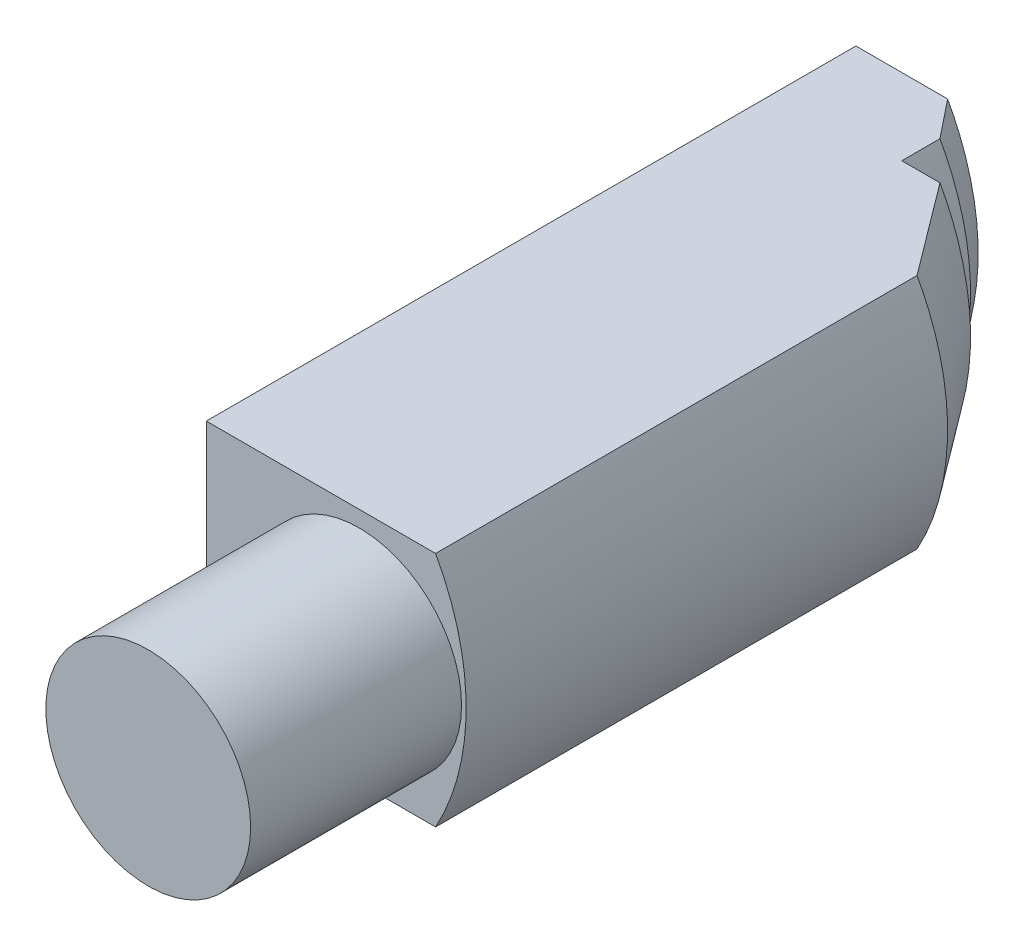
ISO-10303-21;
HEADER;
FILE_DESCRIPTION(('STEP AP214'),'2;1');
FILE_NAME('part.step','',(''),(''),'','','');
FILE_SCHEMA(('AUTOMOTIVE_DESIGN { 1 0 10303 214 1 1 1 1 }'));
ENDSEC;
DATA;
#1=APPLICATION_CONTEXT('core data for automotive mechanical design processes');
#2=APPLICATION_PROTOCOL_DEFINITION('international standard','automotive_design',2000,#1);
#3=PRODUCT_CONTEXT('',#1,'mechanical');
#4=PRODUCT('Part','Part','',(#3));
#5=PRODUCT_RELATED_PRODUCT_CATEGORY('part','',(#4));
#6=PRODUCT_DEFINITION_FORMATION('','',#4);
#7=PRODUCT_DEFINITION_CONTEXT('part definition',#1,'design');
#8=PRODUCT_DEFINITION('design','',#6,#7);
#9=PRODUCT_DEFINITION_SHAPE('','',#8);
#10=(LENGTH_UNIT() NAMED_UNIT(*) SI_UNIT(.MILLI.,.METRE.));
#11=(NAMED_UNIT(*) PLANE_ANGLE_UNIT() SI_UNIT($,.RADIAN.));
#12=(NAMED_UNIT(*) SI_UNIT($,.STERADIAN.) SOLID_ANGLE_UNIT());
#13=UNCERTAINTY_MEASURE_WITH_UNIT(LENGTH_MEASURE(1.E-05),#10,'distance_accuracy_value','');
#14=(GEOMETRIC_REPRESENTATION_CONTEXT(3) GLOBAL_UNCERTAINTY_ASSIGNED_CONTEXT((#13)) GLOBAL_UNIT_ASSIGNED_CONTEXT((#10,
#11,#12)) REPRESENTATION_CONTEXT('',''));
#15=CARTESIAN_POINT('',(0.,0.,0.));
#16=DIRECTION('',(0.,0.,1.));
#17=DIRECTION('',(1.,0.,0.));
#18=AXIS2_PLACEMENT_3D('',#15,#16,#17);
#19=CARTESIAN_POINT('',(-75.,-77.5,425.));
#20=DIRECTION('',(0.,1.,0.));
#21=DIRECTION('',(0.,0.,1.));
#22=AXIS2_PLACEMENT_3D('',#19,#20,#21);
#23=PLANE('',#22);
#24=DIRECTION('',(-0.62469504755442,0.,-0.780868809443034));
#25=VECTOR('',#24,1.);
#26=CARTESIAN_POINT('',(4.99999999999996,-77.5,24.9999999999999));
#27=LINE('',#26,#25);
#28=CARTESIAN_POINT('',(4.99999999999996,-77.5,24.9999999999999));
#29=VERTEX_POINT('',#28);
#30=CARTESIAN_POINT('',(-15.,-77.5,-3.20056481317721E-13));
#31=VERTEX_POINT('',#30);
#32=EDGE_CURVE('E204',#29,#31,#27,.T.);
#33=ORIENTED_EDGE('',*,*,#32,.F.);
#34=DIRECTION('',(0.,0.,-1.));
#35=VECTOR('',#34,1.);
#36=CARTESIAN_POINT('',(4.9999999999999,-77.5,49.9999999999999));
#37=LINE('',#36,#35);
#38=CARTESIAN_POINT('',(4.9999999999999,-77.5,49.9999999999999));
#39=VERTEX_POINT('',#38);
#40=EDGE_CURVE('E120',#39,#29,#37,.T.);
#41=ORIENTED_EDGE('',*,*,#40,.F.);
#42=DIRECTION('',(-1.,0.,0.));
#43=VECTOR('',#42,1.);
#44=CARTESIAN_POINT('',(4.9999999999999,-77.5,49.9999999999999));
#45=LINE('',#44,#43);
#46=CARTESIAN_POINT('',(29.9999999999999,-77.5,49.9999999999999));
#47=VERTEX_POINT('',#46);
#48=EDGE_CURVE('E205',#47,#39,#45,.T.);
#49=ORIENTED_EDGE('',*,*,#48,.F.);
#50=DIRECTION('',(-0.599999999999999,0.,-0.800000000000001));
#51=VECTOR('',#50,1.);
#52=CARTESIAN_POINT('',(29.9999999999999,-77.5,49.9999999999999));
#53=LINE('',#52,#51);
#54=CARTESIAN_POINT('',(74.9999999999998,-77.5,110.));
#55=VERTEX_POINT('',#54);
#56=EDGE_CURVE('E193',#55,#47,#53,.T.);
#57=ORIENTED_EDGE('',*,*,#56,.F.);
#58=DIRECTION('',(0.,0.,-1.));
#59=VECTOR('',#58,1.);
#60=CARTESIAN_POINT('',(75.0000000000001,-77.5,425.));
#61=LINE('',#60,#59);
#62=CARTESIAN_POINT('',(75.0000000000001,-77.5,425.));
#63=VERTEX_POINT('',#62);
#64=EDGE_CURVE('E306',#63,#55,#61,.T.);
#65=ORIENTED_EDGE('',*,*,#64,.F.);
#66=DIRECTION('',(1.,0.,0.));
#67=VECTOR('',#66,1.);
#68=CARTESIAN_POINT('',(-75.,-77.5,425.));
#69=LINE('',#68,#67);
#70=CARTESIAN_POINT('',(-75.,-77.5,425.));
#71=VERTEX_POINT('',#70);
#72=EDGE_CURVE('E167',#71,#63,#69,.T.);
#73=ORIENTED_EDGE('',*,*,#72,.F.);
#74=DIRECTION('',(0.,0.,-1.));
#75=VECTOR('',#74,1.);
#76=CARTESIAN_POINT('',(-75.,-77.5,425.));
#77=LINE('',#76,#75);
#78=CARTESIAN_POINT('',(-75.,-77.5,0.));
#79=VERTEX_POINT('',#78);
#80=EDGE_CURVE('E126',#71,#79,#77,.T.);
#81=ORIENTED_EDGE('',*,*,#80,.T.);
#82=DIRECTION('',(1.,0.,0.));
#83=VECTOR('',#82,1.);
#84=CARTESIAN_POINT('',(-75.,-77.5,0.));
#85=LINE('',#84,#83);
#86=EDGE_CURVE('E297',#79,#31,#85,.T.);
#87=ORIENTED_EDGE('',*,*,#86,.T.);
#88=EDGE_LOOP('',(#33,#41,#49,#57,#65,#73,#81,#87));
#89=FACE_BOUND('',#88,.T.);
#90=ADVANCED_FACE('F116',(#89),#23,.F.);
#91=CARTESIAN_POINT('',(-75.,77.5,425.));
#92=DIRECTION('',(0.,-1.,0.));
#93=DIRECTION('',(0.,0.,-1.));
#94=AXIS2_PLACEMENT_3D('',#91,#92,#93);
#95=PLANE('',#94);
#96=DIRECTION('',(-0.599999999999996,0.,-0.800000000000003));
#97=VECTOR('',#96,1.);
#98=CARTESIAN_POINT('',(29.9999999999998,77.5,49.9999999999998));
#99=LINE('',#98,#97);
#100=CARTESIAN_POINT('',(75.,77.5,110.));
#101=VERTEX_POINT('',#100);
#102=CARTESIAN_POINT('',(29.9999999999998,77.5,49.9999999999998));
#103=VERTEX_POINT('',#102);
#104=EDGE_CURVE('E134',#101,#103,#99,.T.);
#105=ORIENTED_EDGE('',*,*,#104,.T.);
#106=DIRECTION('',(-1.,0.,0.));
#107=VECTOR('',#106,1.);
#108=CARTESIAN_POINT('',(4.99999999999975,77.5,49.9999999999997));
#109=LINE('',#108,#107);
#110=CARTESIAN_POINT('',(4.99999999999975,77.5,49.9999999999997));
#111=VERTEX_POINT('',#110);
#112=EDGE_CURVE('E215',#103,#111,#109,.T.);
#113=ORIENTED_EDGE('',*,*,#112,.T.);
#114=DIRECTION('',(0.,0.,-1.));
#115=VECTOR('',#114,1.);
#116=CARTESIAN_POINT('',(4.99999999999975,77.5,49.9999999999997));
#117=LINE('',#116,#115);
#118=CARTESIAN_POINT('',(4.99999999999987,77.5,24.9999999999997));
#119=VERTEX_POINT('',#118);
#120=EDGE_CURVE('E227',#111,#119,#117,.T.);
#121=ORIENTED_EDGE('',*,*,#120,.T.);
#122=DIRECTION('',(-0.624695047554418,0.,-0.780868809443035));
#123=VECTOR('',#122,1.);
#124=CARTESIAN_POINT('',(4.99999999999987,77.5,24.9999999999997));
#125=LINE('',#124,#123);
#126=CARTESIAN_POINT('',(-15.,77.5,-5.62050406216485E-13));
#127=VERTEX_POINT('',#126);
#128=EDGE_CURVE('E239',#119,#127,#125,.T.);
#129=ORIENTED_EDGE('',*,*,#128,.T.);
#130=DIRECTION('',(-1.,0.,0.));
#131=VECTOR('',#130,1.);
#132=CARTESIAN_POINT('',(-75.,77.5,0.));
#133=LINE('',#132,#131);
#134=CARTESIAN_POINT('',(-75.,77.5,0.));
#135=VERTEX_POINT('',#134);
#136=EDGE_CURVE('E159',#127,#135,#133,.T.);
#137=ORIENTED_EDGE('',*,*,#136,.T.);
#138=DIRECTION('',(0.,0.,-1.));
#139=VECTOR('',#138,1.);
#140=CARTESIAN_POINT('',(-75.,77.5,425.));
#141=LINE('',#140,#139);
#142=CARTESIAN_POINT('',(-75.,77.5,425.));
#143=VERTEX_POINT('',#142);
#144=EDGE_CURVE('E307',#143,#135,#141,.T.);
#145=ORIENTED_EDGE('',*,*,#144,.F.);
#146=DIRECTION('',(-1.,0.,0.));
#147=VECTOR('',#146,1.);
#148=CARTESIAN_POINT('',(-75.,77.5,425.));
#149=LINE('',#148,#147);
#150=CARTESIAN_POINT('',(75.,77.5,425.));
#151=VERTEX_POINT('',#150);
#152=EDGE_CURVE('E144',#151,#143,#149,.T.);
#153=ORIENTED_EDGE('',*,*,#152,.F.);
#154=DIRECTION('',(0.,0.,-1.));
#155=VECTOR('',#154,1.);
#156=CARTESIAN_POINT('',(75.,77.5,425.));
#157=LINE('',#156,#155);
#158=EDGE_CURVE('E250',#151,#101,#157,.T.);
#159=ORIENTED_EDGE('',*,*,#158,.T.);
#160=EDGE_LOOP('',(#105,#113,#121,#129,#137,#145,#153,#159));
#161=FACE_BOUND('',#160,.T.);
#162=ADVANCED_FACE('F247',(#161),#95,.F.);
#163=CARTESIAN_POINT('',(-75.,77.5,425.));
#164=DIRECTION('',(1.,0.,0.));
#165=DIRECTION('',(0.,1.,0.));
#166=AXIS2_PLACEMENT_3D('',#163,#164,#165);
#167=PLANE('',#166);
#168=DIRECTION('',(0.,-1.,0.));
#169=VECTOR('',#168,1.);
#170=CARTESIAN_POINT('',(-75.,77.5,0.));
#171=LINE('',#170,#169);
#172=EDGE_CURVE('E295',#135,#79,#171,.T.);
#173=ORIENTED_EDGE('',*,*,#172,.T.);
#174=ORIENTED_EDGE('',*,*,#80,.F.);
#175=DIRECTION('',(0.,-1.,0.));
#176=VECTOR('',#175,1.);
#177=CARTESIAN_POINT('',(-75.,77.5,425.));
#178=LINE('',#177,#176);
#179=EDGE_CURVE('E296',#143,#71,#178,.T.);
#180=ORIENTED_EDGE('',*,*,#179,.F.);
#181=ORIENTED_EDGE('',*,*,#144,.T.);
#182=EDGE_LOOP('',(#173,#174,#180,#181));
#183=FACE_BOUND('',#182,.T.);
#184=ADVANCED_FACE('F118',(#183),#167,.F.);
#185=CARTESIAN_POINT('',(-65.15625,0.,425.));
#186=DIRECTION('',(0.,0.,-1.));
#187=DIRECTION('',(-1.,0.,0.));
#188=AXIS2_PLACEMENT_3D('',#185,#186,#187);
#189=CYLINDRICAL_SURFACE('',#188,160.15625);
#190=ORIENTED_EDGE('',*,*,#64,.T.);
#191=CARTESIAN_POINT('',(74.9999999999998,-77.5,110.));
#192=CARTESIAN_POINT('',(101.663535191219,-29.2798567207182,110.));
#193=CARTESIAN_POINT('',(101.663535191219,29.2798567207181,110.));
#194=CARTESIAN_POINT('',(74.9999999999995,77.5,110.));
#195=B_SPLINE_CURVE_WITH_KNOTS('',3,(#191,#192,#193,#194),.UNSPECIFIED.,.F.,.F.,(4,4),(0.,1.),.UNSPECIFIED.);
#196=EDGE_CURVE('E199',#55,#101,#195,.T.);
#197=ORIENTED_EDGE('',*,*,#196,.T.);
#198=ORIENTED_EDGE('',*,*,#158,.F.);
#199=CARTESIAN_POINT('',(-65.15625,0.,425.));
#200=DIRECTION('',(0.,0.,1.));
#201=DIRECTION('',(-1.,0.,0.));
#202=AXIS2_PLACEMENT_3D('',#199,#200,#201);
#203=CIRCLE('',#202,160.15625);
#204=EDGE_CURVE('E317',#63,#151,#203,.T.);
#205=ORIENTED_EDGE('',*,*,#204,.F.);
#206=EDGE_LOOP('',(#190,#197,#198,#205));
#207=FACE_BOUND('',#206,.T.);
#208=ADVANCED_FACE('F271',(#207),#189,.T.);
#209=CARTESIAN_POINT('',(-65.15625,0.,425.));
#210=DIRECTION('',(0.,0.,-1.));
#211=DIRECTION('',(-1.,0.,0.));
#212=AXIS2_PLACEMENT_3D('',#209,#210,#211);
#213=PLANE('',#212);
#214=CARTESIAN_POINT('',(25.,0.,425.));
#215=DIRECTION('',(0.,0.,1.));
#216=DIRECTION('',(1.,0.,0.));
#217=AXIS2_PLACEMENT_3D('',#214,#215,#216);
#218=CIRCLE('',#217,67.);
#219=CARTESIAN_POINT('',(92.,0.,425.));
#220=VERTEX_POINT('',#219);
#221=EDGE_CURVE('E13',#220,#220,#218,.T.);
#222=ORIENTED_EDGE('',*,*,#221,.F.);
#223=EDGE_LOOP('',(#222));
#224=FACE_BOUND('',#223,.T.);
#225=ORIENTED_EDGE('',*,*,#179,.T.);
#226=ORIENTED_EDGE('',*,*,#72,.T.);
#227=ORIENTED_EDGE('',*,*,#204,.T.);
#228=ORIENTED_EDGE('',*,*,#152,.T.);
#229=EDGE_LOOP('',(#225,#226,#227,#228));
#230=FACE_BOUND('',#229,.T.);
#231=ADVANCED_FACE('F475',(#224,#230),#213,.F.);
#232=CARTESIAN_POINT('',(-65.15625,0.,0.));
#233=DIRECTION('',(0.,0.,-1.));
#234=DIRECTION('',(-1.,0.,0.));
#235=AXIS2_PLACEMENT_3D('',#232,#233,#234);
#236=PLANE('',#235);
#237=CARTESIAN_POINT('',(-15.,-77.5,-3.12250225675825E-13));
#238=CARTESIAN_POINT('',(11.6635351912193,-29.2798567207182,-3.94938711364053E-13));
#239=CARTESIAN_POINT('',(11.6635351912193,29.2798567207181,-4.78494558790269E-13));
#240=CARTESIAN_POINT('',(-15.,77.5,-5.62050406216485E-13));
#241=B_SPLINE_CURVE_WITH_KNOTS('',3,(#237,#238,#239,#240),.UNSPECIFIED.,.F.,.F.,(4,4),(0.,1.),.UNSPECIFIED.);
#242=EDGE_CURVE('E292',#31,#127,#241,.T.);
#243=ORIENTED_EDGE('',*,*,#242,.F.);
#244=ORIENTED_EDGE('',*,*,#86,.F.);
#245=ORIENTED_EDGE('',*,*,#172,.F.);
#246=ORIENTED_EDGE('',*,*,#136,.F.);
#247=EDGE_LOOP('',(#243,#244,#245,#246));
#248=FACE_BOUND('',#247,.T.);
#249=ADVANCED_FACE('F269',(#248),#236,.T.);
#250=CARTESIAN_POINT('',(29.9999999999999,-77.5,49.9999999999999));
#251=CARTESIAN_POINT('',(56.6635351912192,-29.2798567207182,49.9999999999999));
#252=CARTESIAN_POINT('',(56.6635351912191,29.2798567207181,49.9999999999999));
#253=CARTESIAN_POINT('',(29.9999999999998,77.5,49.9999999999998));
#254=CARTESIAN_POINT('',(33.7499999999999,-77.5,54.9999999999999));
#255=CARTESIAN_POINT('',(60.4135351912191,-29.2798567207182,54.9999999999999));
#256=CARTESIAN_POINT('',(60.4135351912191,29.2798567207181,54.9999999999999));
#257=CARTESIAN_POINT('',(33.7499999999997,77.5,54.9999999999998));
#258=CARTESIAN_POINT('',(41.2499999999999,-77.5000000000001,65.));
#259=CARTESIAN_POINT('',(67.9135351912192,-29.2798567207183,64.9999999999999));
#260=CARTESIAN_POINT('',(67.9135351912192,29.2798567207182,64.9999999999999));
#261=CARTESIAN_POINT('',(41.2499999999998,77.5000000000001,64.9999999999999));
#262=CARTESIAN_POINT('',(52.4999999999998,-77.4999999999999,79.9999999999999));
#263=CARTESIAN_POINT('',(79.163535191219,-29.2798567207182,79.9999999999999));
#264=CARTESIAN_POINT('',(79.163535191219,29.2798567207181,79.9999999999999));
#265=CARTESIAN_POINT('',(52.4999999999995,77.4999999999999,79.9999999999999));
#266=CARTESIAN_POINT('',(63.7499999999999,-77.5000000000001,94.9999999999999));
#267=CARTESIAN_POINT('',(90.4135351912191,-29.2798567207183,94.9999999999999));
#268=CARTESIAN_POINT('',(90.4135351912191,29.2798567207181,94.9999999999999));
#269=CARTESIAN_POINT('',(63.7499999999997,77.5,94.9999999999999));
#270=CARTESIAN_POINT('',(71.2499999999998,-77.5,105.));
#271=CARTESIAN_POINT('',(97.913535191219,-29.2798567207182,105.));
#272=CARTESIAN_POINT('',(97.9135351912189,29.2798567207181,105.));
#273=CARTESIAN_POINT('',(71.2499999999995,77.5,105.));
#274=CARTESIAN_POINT('',(74.9999999999998,-77.5,110.));
#275=CARTESIAN_POINT('',(101.663535191219,-29.2798567207182,110.));
#276=CARTESIAN_POINT('',(101.663535191219,29.2798567207181,110.));
#277=CARTESIAN_POINT('',(74.9999999999995,77.5,110.));
#278=B_SPLINE_SURFACE_WITH_KNOTS('',3,3,((#250,#251,#252,#253),(#254,#255,#256,#257),(#258,#259,
#260,#261),(#262,#263,#264,#265),(#266,#267,#268,#269),(#270,#271,#272,#273),(#274,#275,#276,
#277)),.UNSPECIFIED.,.F.,.F.,.F.,(4,1,1,1,4),(4,4),(0.481815391201008,0.534334101552257,
0.586852811903506,0.639371522254755,0.691890232606005),(0.,1.),.UNSPECIFIED.);
#279=CARTESIAN_POINT('',(29.9999999999999,-77.5,49.9999999999999));
#280=CARTESIAN_POINT('',(56.6635351912192,-29.2798567207182,49.9999999999999));
#281=CARTESIAN_POINT('',(56.6635351912191,29.2798567207181,49.9999999999999));
#282=CARTESIAN_POINT('',(29.9999999999998,77.5,49.9999999999998));
#283=B_SPLINE_CURVE_WITH_KNOTS('',3,(#279,#280,#281,#282),.UNSPECIFIED.,.F.,.F.,(4,4),(0.,1.),.UNSPECIFIED.);
#284=EDGE_CURVE('E197',#47,#103,#283,.T.);
#285=ORIENTED_EDGE('',*,*,#56,.T.);
#286=ORIENTED_EDGE('',*,*,#284,.T.);
#287=ORIENTED_EDGE('',*,*,#104,.F.);
#288=ORIENTED_EDGE('',*,*,#196,.F.);
#289=EDGE_LOOP('',(#285,#286,#287,#288));
#290=FACE_BOUND('',#289,.T.);
#291=ADVANCED_FACE('F196',(#290),#278,.F.);
#292=CARTESIAN_POINT('',(4.9999999999999,-77.5,49.9999999999999));
#293=DIRECTION('',(0.,0.,1.));
#294=DIRECTION('',(1.,0.,0.));
#295=AXIS2_PLACEMENT_3D('',#292,#293,#294);
#296=PLANE('',#295);
#297=ORIENTED_EDGE('',*,*,#48,.T.);
#298=CARTESIAN_POINT('',(4.9999999999999,-77.5,49.9999999999999));
#299=CARTESIAN_POINT('',(31.6635351912191,-29.2798567207182,49.9999999999998));
#300=CARTESIAN_POINT('',(31.6635351912191,29.2798567207181,49.9999999999997));
#301=CARTESIAN_POINT('',(4.99999999999975,77.5,49.9999999999997));
#302=B_SPLINE_CURVE_WITH_KNOTS('',3,(#298,#299,#300,#301),.UNSPECIFIED.,.F.,.F.,(4,4),(0.,1.),.UNSPECIFIED.);
#303=EDGE_CURVE('E216',#39,#111,#302,.T.);
#304=ORIENTED_EDGE('',*,*,#303,.T.);
#305=ORIENTED_EDGE('',*,*,#112,.F.);
#306=ORIENTED_EDGE('',*,*,#284,.F.);
#307=EDGE_LOOP('',(#297,#304,#305,#306));
#308=FACE_BOUND('',#307,.T.);
#309=ADVANCED_FACE('F211',(#308),#296,.F.);
#310=CARTESIAN_POINT('',(4.99999999999996,-77.5,24.9999999999999));
#311=CARTESIAN_POINT('',(31.6635351912192,-29.2798567207182,24.9999999999998));
#312=CARTESIAN_POINT('',(31.6635351912192,29.2798567207181,24.9999999999997));
#313=CARTESIAN_POINT('',(4.99999999999987,77.5,24.9999999999997));
#314=CARTESIAN_POINT('',(4.99999999999995,-77.5,27.0833333333332));
#315=CARTESIAN_POINT('',(31.6635351912192,-29.2798567207182,27.0833333333331));
#316=CARTESIAN_POINT('',(31.6635351912192,29.2798567207181,27.0833333333331));
#317=CARTESIAN_POINT('',(4.99999999999986,77.5,27.083333333333));
#318=CARTESIAN_POINT('',(4.99999999999995,-77.5000000000001,31.2499999999999));
#319=CARTESIAN_POINT('',(31.6635351912192,-29.2798567207182,31.2499999999998));
#320=CARTESIAN_POINT('',(31.6635351912192,29.2798567207182,31.2499999999998));
#321=CARTESIAN_POINT('',(4.99999999999985,77.5000000000001,31.2499999999997));
#322=CARTESIAN_POINT('',(4.99999999999993,-77.4999999999999,37.4999999999999));
#323=CARTESIAN_POINT('',(31.6635351912192,-29.2798567207182,37.4999999999998));
#324=CARTESIAN_POINT('',(31.6635351912192,29.2798567207181,37.4999999999997));
#325=CARTESIAN_POINT('',(4.9999999999998,77.4999999999999,37.4999999999996));
#326=CARTESIAN_POINT('',(4.99999999999991,-77.5000000000001,43.7499999999999));
#327=CARTESIAN_POINT('',(31.6635351912192,-29.2798567207183,43.7499999999998));
#328=CARTESIAN_POINT('',(31.6635351912192,29.2798567207182,43.7499999999998));
#329=CARTESIAN_POINT('',(4.99999999999979,77.5000000000001,43.7499999999997));
#330=CARTESIAN_POINT('',(4.99999999999991,-77.5,47.9166666666665));
#331=CARTESIAN_POINT('',(31.6635351912192,-29.2798567207182,47.9166666666665));
#332=CARTESIAN_POINT('',(31.6635351912191,29.2798567207181,47.9166666666664));
#333=CARTESIAN_POINT('',(4.99999999999976,77.5,47.9166666666663));
#334=CARTESIAN_POINT('',(4.9999999999999,-77.5,49.9999999999999));
#335=CARTESIAN_POINT('',(31.6635351912191,-29.2798567207182,49.9999999999998));
#336=CARTESIAN_POINT('',(31.6635351912191,29.2798567207181,49.9999999999997));
#337=CARTESIAN_POINT('',(4.99999999999975,77.5,49.9999999999997));
#338=B_SPLINE_SURFACE_WITH_KNOTS('',3,3,((#310,#311,#312,#313),(#314,#315,#316,#317),(#318,#319,
#320,#321),(#322,#323,#324,#325),(#326,#327,#328,#329),(#330,#331,#332,#333),(#334,#335,#336,
#337)),.UNSPECIFIED.,.F.,.F.,.F.,(4,1,1,1,4),(4,4),(0.34176549693101,0.35927173371476,
0.376777970498509,0.394284207282259,0.411790444066009),(0.,1.),.UNSPECIFIED.);
#339=CARTESIAN_POINT('',(4.99999999999996,-77.5,24.9999999999999));
#340=CARTESIAN_POINT('',(31.6635351912192,-29.2798567207182,24.9999999999998));
#341=CARTESIAN_POINT('',(31.6635351912192,29.2798567207181,24.9999999999997));
#342=CARTESIAN_POINT('',(4.99999999999987,77.5,24.9999999999997));
#343=B_SPLINE_CURVE_WITH_KNOTS('',3,(#339,#340,#341,#342),.UNSPECIFIED.,.F.,.F.,(4,4),(0.,1.),.UNSPECIFIED.);
#344=EDGE_CURVE('E400',#29,#119,#343,.T.);
#345=ORIENTED_EDGE('',*,*,#40,.T.);
#346=ORIENTED_EDGE('',*,*,#344,.T.);
#347=ORIENTED_EDGE('',*,*,#120,.F.);
#348=ORIENTED_EDGE('',*,*,#303,.F.);
#349=EDGE_LOOP('',(#345,#346,#347,#348));
#350=FACE_BOUND('',#349,.T.);
#351=ADVANCED_FACE('F334',(#350),#338,.F.);
#352=CARTESIAN_POINT('',(-15.,-77.5,-3.12250225675825E-13));
#353=CARTESIAN_POINT('',(11.6635351912193,-29.2798567207182,-3.94938711364053E-13));
#354=CARTESIAN_POINT('',(11.6635351912193,29.2798567207181,-4.78494558790269E-13));
#355=CARTESIAN_POINT('',(-15.,77.5,-5.62050406216485E-13));
#356=CARTESIAN_POINT('',(-13.3333333333333,-77.5,2.08333333333304));
#357=CARTESIAN_POINT('',(13.330201857886,-29.2798567207182,2.08333333333296));
#358=CARTESIAN_POINT('',(13.330201857886,29.2798567207181,2.08333333333288));
#359=CARTESIAN_POINT('',(-13.3333333333333,77.5,2.08333333333279));
#360=CARTESIAN_POINT('',(-10.,-77.5,6.24999999999974));
#361=CARTESIAN_POINT('',(16.6635351912193,-29.2798567207182,6.24999999999966));
#362=CARTESIAN_POINT('',(16.6635351912193,29.2798567207181,6.24999999999958));
#363=CARTESIAN_POINT('',(-10.,77.4999999999999,6.2499999999995));
#364=CARTESIAN_POINT('',(-5.,-77.5000000000001,12.4999999999998));
#365=CARTESIAN_POINT('',(21.6635351912193,-29.2798567207182,12.4999999999997));
#366=CARTESIAN_POINT('',(21.6635351912193,29.2798567207182,12.4999999999996));
#367=CARTESIAN_POINT('',(-5.00000000000006,77.5000000000002,12.4999999999996));
#368=CARTESIAN_POINT('',(0.,-77.4999999999999,18.7499999999998));
#369=CARTESIAN_POINT('',(26.6635351912192,-29.2798567207182,18.7499999999998));
#370=CARTESIAN_POINT('',(26.6635351912192,29.2798567207181,18.7499999999997));
#371=CARTESIAN_POINT('',(0.,77.4999999999999,18.7499999999996));
#372=CARTESIAN_POINT('',(3.33333333333329,-77.5,22.9166666666665));
#373=CARTESIAN_POINT('',(29.9968685245526,-29.2798567207182,22.9166666666665));
#374=CARTESIAN_POINT('',(29.9968685245526,29.2798567207181,22.9166666666664));
#375=CARTESIAN_POINT('',(3.33333333333321,77.5,22.9166666666663));
#376=CARTESIAN_POINT('',(4.99999999999996,-77.5,24.9999999999999));
#377=CARTESIAN_POINT('',(31.6635351912192,-29.2798567207182,24.9999999999998));
#378=CARTESIAN_POINT('',(31.6635351912192,29.2798567207181,24.9999999999997));
#379=CARTESIAN_POINT('',(4.99999999999987,77.5,24.9999999999997));
#380=B_SPLINE_SURFACE_WITH_KNOTS('',3,3,((#352,#353,#354,#355),(#356,#357,#358,#359),(#360,#361,
#362,#363),(#364,#365,#366,#367),(#368,#369,#370,#371),(#372,#373,#374,#375),(#376,#377,#378,
#379)),.UNSPECIFIED.,.F.,.F.,.F.,(4,1,1,1,4),(4,4),(0.252089809685996,0.27450873149725,
0.296927653308503,0.319346575119756,0.34176549693101),(0.,1.),.UNSPECIFIED.);
#381=ORIENTED_EDGE('',*,*,#32,.T.);
#382=ORIENTED_EDGE('',*,*,#242,.T.);
#383=ORIENTED_EDGE('',*,*,#128,.F.);
#384=ORIENTED_EDGE('',*,*,#344,.F.);
#385=EDGE_LOOP('',(#381,#382,#383,#384));
#386=FACE_BOUND('',#385,.T.);
#387=ADVANCED_FACE('F362',(#386),#380,.F.);
#388=CARTESIAN_POINT('',(25.,0.,563.));
#389=DIRECTION('',(0.,0.,-1.));
#390=DIRECTION('',(-1.,0.,0.));
#391=AXIS2_PLACEMENT_3D('',#388,#389,#390);
#392=CYLINDRICAL_SURFACE('',#391,67.);
#393=CARTESIAN_POINT('',(25.,0.,563.));
#394=DIRECTION('',(0.,0.,1.));
#395=DIRECTION('',(1.,0.,0.));
#396=AXIS2_PLACEMENT_3D('',#393,#394,#395);
#397=CIRCLE('',#396,67.);
#398=CARTESIAN_POINT('',(92.,0.,563.));
#399=VERTEX_POINT('',#398);
#400=EDGE_CURVE('E220',#399,#399,#397,.T.);
#401=ORIENTED_EDGE('',*,*,#400,.F.);
#402=EDGE_LOOP('',(#401));
#403=FACE_BOUND('',#402,.T.);
#404=ORIENTED_EDGE('',*,*,#221,.T.);
#405=EDGE_LOOP('',(#404));
#406=FACE_BOUND('',#405,.T.);
#407=ADVANCED_FACE('F373',(#403,#406),#392,.T.);
#408=CARTESIAN_POINT('',(25.,0.,563.));
#409=DIRECTION('',(0.,0.,1.));
#410=DIRECTION('',(1.,0.,0.));
#411=AXIS2_PLACEMENT_3D('',#408,#409,#410);
#412=PLANE('',#411);
#413=ORIENTED_EDGE('',*,*,#400,.T.);
#414=EDGE_LOOP('',(#413));
#415=FACE_BOUND('',#414,.T.);
#416=ADVANCED_FACE('F511',(#415),#412,.T.);
#417=CLOSED_SHELL('',(#90,#162,#184,#208,#231,#249,#291,#309,#351,#387,#407,#416));
#418=MANIFOLD_SOLID_BREP('B2',#417);
#419=ADVANCED_BREP_SHAPE_REPRESENTATION('',(#18,#418),#14);
#420=SHAPE_DEFINITION_REPRESENTATION(#9,#419);
ENDSEC;
END-ISO-10303-21;
